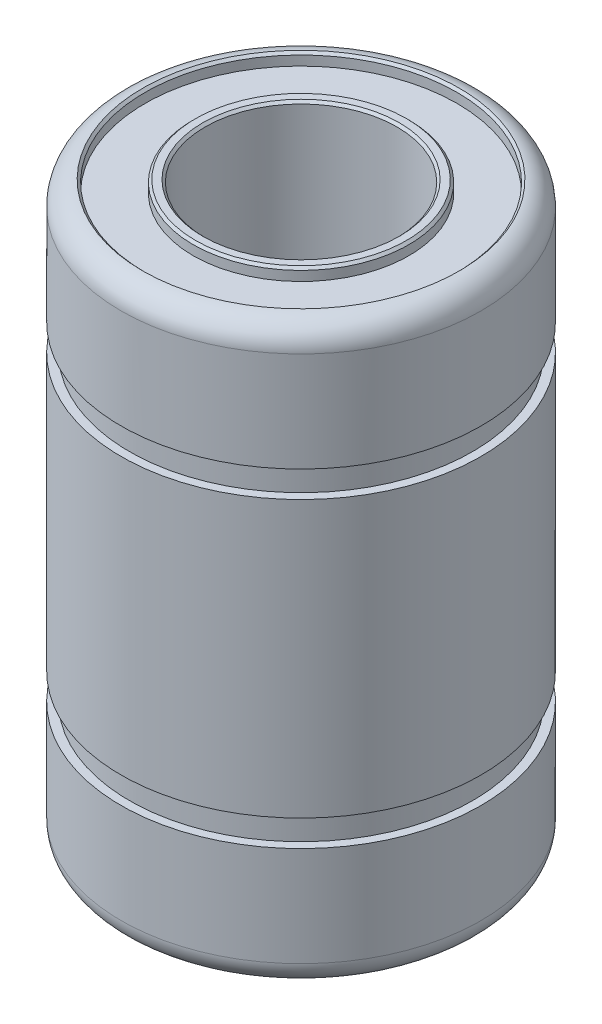
ISO-10303-21;
HEADER;
FILE_DESCRIPTION(('STEP AP214'),'2;1');
FILE_NAME('part.step','',(''),(''),'','','');
FILE_SCHEMA(('AUTOMOTIVE_DESIGN { 1 0 10303 214 1 1 1 1 }'));
ENDSEC;
DATA;
#1=APPLICATION_CONTEXT('core data for automotive mechanical design processes');
#2=APPLICATION_PROTOCOL_DEFINITION('international standard','automotive_design',2000,#1);
#3=PRODUCT_CONTEXT('',#1,'mechanical');
#4=PRODUCT('Part','Part','',(#3));
#5=PRODUCT_RELATED_PRODUCT_CATEGORY('part','',(#4));
#6=PRODUCT_DEFINITION_FORMATION('','',#4);
#7=PRODUCT_DEFINITION_CONTEXT('part definition',#1,'design');
#8=PRODUCT_DEFINITION('design','',#6,#7);
#9=PRODUCT_DEFINITION_SHAPE('','',#8);
#10=(LENGTH_UNIT() NAMED_UNIT(*) SI_UNIT(.MILLI.,.METRE.));
#11=(NAMED_UNIT(*) PLANE_ANGLE_UNIT() SI_UNIT($,.RADIAN.));
#12=(NAMED_UNIT(*) SI_UNIT($,.STERADIAN.) SOLID_ANGLE_UNIT());
#13=UNCERTAINTY_MEASURE_WITH_UNIT(LENGTH_MEASURE(1.E-05),#10,'distance_accuracy_value','');
#14=(GEOMETRIC_REPRESENTATION_CONTEXT(3) GLOBAL_UNCERTAINTY_ASSIGNED_CONTEXT((#13)) GLOBAL_UNIT_ASSIGNED_CONTEXT((#10,
#11,#12)) REPRESENTATION_CONTEXT('',''));
#15=CARTESIAN_POINT('',(0.,0.,0.));
#16=DIRECTION('',(0.,0.,1.));
#17=DIRECTION('',(1.,0.,0.));
#18=AXIS2_PLACEMENT_3D('',#15,#16,#17);
#19=CARTESIAN_POINT('',(0.,0.,0.));
#20=DIRECTION('',(0.,-1.,0.));
#21=DIRECTION('',(0.,0.,-1.));
#22=AXIS2_PLACEMENT_3D('',#19,#20,#21);
#23=CYLINDRICAL_SURFACE('',#22,4.);
#24=CARTESIAN_POINT('',(0.,0.0999999999999993,0.));
#25=DIRECTION('',(0.,-1.,0.));
#26=DIRECTION('',(0.,0.,-1.));
#27=AXIS2_PLACEMENT_3D('',#24,#25,#26);
#28=CIRCLE('',#27,4.);
#29=CARTESIAN_POINT('',(0.,0.0999999999999993,-4.));
#30=VERTEX_POINT('',#29);
#31=EDGE_CURVE('E59',#30,#30,#28,.T.);
#32=ORIENTED_EDGE('',*,*,#31,.T.);
#33=EDGE_LOOP('',(#32));
#34=FACE_BOUND('',#33,.T.);
#35=CARTESIAN_POINT('',(0.,23.9,0.));
#36=DIRECTION('',(0.,1.,0.));
#37=DIRECTION('',(0.,0.,1.));
#38=AXIS2_PLACEMENT_3D('',#35,#36,#37);
#39=CIRCLE('',#38,4.);
#40=CARTESIAN_POINT('',(0.,23.9,4.));
#41=VERTEX_POINT('',#40);
#42=EDGE_CURVE('E62',#41,#41,#39,.T.);
#43=ORIENTED_EDGE('',*,*,#42,.T.);
#44=EDGE_LOOP('',(#43));
#45=FACE_BOUND('',#44,.T.);
#46=ADVANCED_FACE('F30',(#34,#45),#23,.F.);
#47=CARTESIAN_POINT('',(4.,24.,0.));
#48=DIRECTION('',(0.,1.,0.));
#49=DIRECTION('',(0.,0.,1.));
#50=AXIS2_PLACEMENT_3D('',#47,#48,#49);
#51=PLANE('',#50);
#52=CARTESIAN_POINT('',(0.,24.,0.));
#53=DIRECTION('',(0.,1.,0.));
#54=DIRECTION('',(0.,0.,1.));
#55=AXIS2_PLACEMENT_3D('',#52,#53,#54);
#56=CIRCLE('',#55,4.39999999999999);
#57=CARTESIAN_POINT('',(0.,24.,4.39999999999999));
#58=VERTEX_POINT('',#57);
#59=EDGE_CURVE('E41',#58,#58,#56,.T.);
#60=ORIENTED_EDGE('',*,*,#59,.T.);
#61=EDGE_LOOP('',(#60));
#62=FACE_BOUND('',#61,.T.);
#63=CARTESIAN_POINT('',(0.,24.,0.));
#64=DIRECTION('',(0.,1.,0.));
#65=DIRECTION('',(0.,0.,1.));
#66=AXIS2_PLACEMENT_3D('',#63,#64,#65);
#67=CIRCLE('',#66,4.1);
#68=CARTESIAN_POINT('',(0.,24.,4.1));
#69=VERTEX_POINT('',#68);
#70=EDGE_CURVE('E45',#69,#69,#67,.F.);
#71=ORIENTED_EDGE('',*,*,#70,.T.);
#72=EDGE_LOOP('',(#71));
#73=FACE_BOUND('',#72,.T.);
#74=ADVANCED_FACE('F135',(#62,#73),#51,.T.);
#75=CARTESIAN_POINT('',(0.,0.,0.));
#76=DIRECTION('',(0.,-1.,0.));
#77=DIRECTION('',(0.,0.,-1.));
#78=AXIS2_PLACEMENT_3D('',#75,#76,#77);
#79=CYLINDRICAL_SURFACE('',#78,4.5);
#80=CARTESIAN_POINT('',(0.,23.9,0.));
#81=DIRECTION('',(0.,1.,0.));
#82=DIRECTION('',(0.,0.,1.));
#83=AXIS2_PLACEMENT_3D('',#80,#81,#82);
#84=CIRCLE('',#83,4.5);
#85=CARTESIAN_POINT('',(0.,23.9,4.5));
#86=VERTEX_POINT('',#85);
#87=EDGE_CURVE('E50',#86,#86,#84,.F.);
#88=ORIENTED_EDGE('',*,*,#87,.T.);
#89=EDGE_LOOP('',(#88));
#90=FACE_BOUND('',#89,.T.);
#91=CARTESIAN_POINT('',(0.,23.5,0.));
#92=DIRECTION('',(0.,-1.,0.));
#93=DIRECTION('',(0.,0.,-1.));
#94=AXIS2_PLACEMENT_3D('',#91,#92,#93);
#95=CIRCLE('',#94,4.5);
#96=CARTESIAN_POINT('',(0.,23.5,-4.5));
#97=VERTEX_POINT('',#96);
#98=EDGE_CURVE('E80',#97,#97,#95,.T.);
#99=ORIENTED_EDGE('',*,*,#98,.F.);
#100=EDGE_LOOP('',(#99));
#101=FACE_BOUND('',#100,.T.);
#102=ADVANCED_FACE('F141',(#90,#101),#79,.T.);
#103=CARTESIAN_POINT('',(4.5,23.5,0.));
#104=DIRECTION('',(0.,1.,0.));
#105=DIRECTION('',(0.,0.,1.));
#106=AXIS2_PLACEMENT_3D('',#103,#104,#105);
#107=PLANE('',#106);
#108=ORIENTED_EDGE('',*,*,#98,.T.);
#109=EDGE_LOOP('',(#108));
#110=FACE_BOUND('',#109,.T.);
#111=CARTESIAN_POINT('',(0.,23.5,0.));
#112=DIRECTION('',(0.,-1.,0.));
#113=DIRECTION('',(0.,0.,-1.));
#114=AXIS2_PLACEMENT_3D('',#111,#112,#113);
#115=CIRCLE('',#114,6.5);
#116=CARTESIAN_POINT('',(0.,23.5,-6.5));
#117=VERTEX_POINT('',#116);
#118=EDGE_CURVE('E83',#117,#117,#115,.T.);
#119=ORIENTED_EDGE('',*,*,#118,.F.);
#120=EDGE_LOOP('',(#119));
#121=FACE_BOUND('',#120,.T.);
#122=ADVANCED_FACE('F283',(#110,#121),#107,.T.);
#123=CARTESIAN_POINT('',(0.,0.,0.));
#124=DIRECTION('',(0.,-1.,0.));
#125=DIRECTION('',(0.,0.,-1.));
#126=AXIS2_PLACEMENT_3D('',#123,#124,#125);
#127=CYLINDRICAL_SURFACE('',#126,6.5);
#128=CARTESIAN_POINT('',(0.,23.9,0.));
#129=DIRECTION('',(0.,1.,0.));
#130=DIRECTION('',(0.,0.,1.));
#131=AXIS2_PLACEMENT_3D('',#128,#129,#130);
#132=CIRCLE('',#131,6.5);
#133=CARTESIAN_POINT('',(0.,23.9,6.5));
#134=VERTEX_POINT('',#133);
#135=EDGE_CURVE('E53',#134,#134,#132,.T.);
#136=ORIENTED_EDGE('',*,*,#135,.T.);
#137=EDGE_LOOP('',(#136));
#138=FACE_BOUND('',#137,.T.);
#139=ORIENTED_EDGE('',*,*,#118,.T.);
#140=EDGE_LOOP('',(#139));
#141=FACE_BOUND('',#140,.T.);
#142=ADVANCED_FACE('F216',(#138,#141),#127,.F.);
#143=CARTESIAN_POINT('',(0.,0.,0.));
#144=DIRECTION('',(0.,-1.,0.));
#145=DIRECTION('',(0.,0.,-1.));
#146=AXIS2_PLACEMENT_3D('',#143,#144,#145);
#147=CYLINDRICAL_SURFACE('',#146,7.5);
#148=CARTESIAN_POINT('',(0.,23.0050125628934,0.));
#149=DIRECTION('',(0.,1.,0.));
#150=DIRECTION('',(0.,0.,1.));
#151=AXIS2_PLACEMENT_3D('',#148,#149,#150);
#152=CIRCLE('',#151,7.5);
#153=CARTESIAN_POINT('',(0.,23.0050125628934,7.5));
#154=VERTEX_POINT('',#153);
#155=EDGE_CURVE('E10',#154,#154,#152,.F.);
#156=ORIENTED_EDGE('',*,*,#155,.T.);
#157=EDGE_LOOP('',(#156));
#158=FACE_BOUND('',#157,.T.);
#159=CARTESIAN_POINT('',(0.,18.85,0.));
#160=DIRECTION('',(0.,-1.,0.));
#161=DIRECTION('',(0.,0.,-1.));
#162=AXIS2_PLACEMENT_3D('',#159,#160,#161);
#163=CIRCLE('',#162,7.5);
#164=CARTESIAN_POINT('',(0.,18.85,-7.5));
#165=VERTEX_POINT('',#164);
#166=EDGE_CURVE('E86',#165,#165,#163,.T.);
#167=ORIENTED_EDGE('',*,*,#166,.F.);
#168=EDGE_LOOP('',(#167));
#169=FACE_BOUND('',#168,.T.);
#170=ADVANCED_FACE('F210',(#158,#169),#147,.T.);
#171=CARTESIAN_POINT('',(7.5,18.85,0.));
#172=DIRECTION('',(0.,-1.,0.));
#173=DIRECTION('',(0.,0.,-1.));
#174=AXIS2_PLACEMENT_3D('',#171,#172,#173);
#175=PLANE('',#174);
#176=ORIENTED_EDGE('',*,*,#166,.T.);
#177=EDGE_LOOP('',(#176));
#178=FACE_BOUND('',#177,.T.);
#179=CARTESIAN_POINT('',(0.,18.85,0.));
#180=DIRECTION('',(0.,-1.,0.));
#181=DIRECTION('',(0.,0.,-1.));
#182=AXIS2_PLACEMENT_3D('',#179,#180,#181);
#183=CIRCLE('',#182,7.15);
#184=CARTESIAN_POINT('',(0.,18.85,-7.15));
#185=VERTEX_POINT('',#184);
#186=EDGE_CURVE('E89',#185,#185,#183,.T.);
#187=ORIENTED_EDGE('',*,*,#186,.F.);
#188=EDGE_LOOP('',(#187));
#189=FACE_BOUND('',#188,.T.);
#190=ADVANCED_FACE('F215',(#178,#189),#175,.T.);
#191=CARTESIAN_POINT('',(0.,0.,0.));
#192=DIRECTION('',(0.,-1.,0.));
#193=DIRECTION('',(0.,0.,-1.));
#194=AXIS2_PLACEMENT_3D('',#191,#192,#193);
#195=CYLINDRICAL_SURFACE('',#194,7.15);
#196=ORIENTED_EDGE('',*,*,#186,.T.);
#197=EDGE_LOOP('',(#196));
#198=FACE_BOUND('',#197,.T.);
#199=CARTESIAN_POINT('',(0.,17.75,0.));
#200=DIRECTION('',(0.,-1.,0.));
#201=DIRECTION('',(0.,0.,-1.));
#202=AXIS2_PLACEMENT_3D('',#199,#200,#201);
#203=CIRCLE('',#202,7.15);
#204=CARTESIAN_POINT('',(0.,17.75,-7.15));
#205=VERTEX_POINT('',#204);
#206=EDGE_CURVE('E92',#205,#205,#203,.T.);
#207=ORIENTED_EDGE('',*,*,#206,.F.);
#208=EDGE_LOOP('',(#207));
#209=FACE_BOUND('',#208,.T.);
#210=ADVANCED_FACE('F354',(#198,#209),#195,.T.);
#211=CARTESIAN_POINT('',(7.5,17.75,0.));
#212=DIRECTION('',(0.,1.,0.));
#213=DIRECTION('',(0.,0.,1.));
#214=AXIS2_PLACEMENT_3D('',#211,#212,#213);
#215=PLANE('',#214);
#216=ORIENTED_EDGE('',*,*,#206,.T.);
#217=EDGE_LOOP('',(#216));
#218=FACE_BOUND('',#217,.T.);
#219=CARTESIAN_POINT('',(0.,17.75,0.));
#220=DIRECTION('',(0.,-1.,0.));
#221=DIRECTION('',(0.,0.,-1.));
#222=AXIS2_PLACEMENT_3D('',#219,#220,#221);
#223=CIRCLE('',#222,7.5);
#224=CARTESIAN_POINT('',(0.,17.75,-7.5));
#225=VERTEX_POINT('',#224);
#226=EDGE_CURVE('E95',#225,#225,#223,.T.);
#227=ORIENTED_EDGE('',*,*,#226,.F.);
#228=EDGE_LOOP('',(#227));
#229=FACE_BOUND('',#228,.T.);
#230=ADVANCED_FACE('F344',(#218,#229),#215,.T.);
#231=CARTESIAN_POINT('',(0.,0.,0.));
#232=DIRECTION('',(0.,-1.,0.));
#233=DIRECTION('',(0.,0.,-1.));
#234=AXIS2_PLACEMENT_3D('',#231,#232,#233);
#235=CYLINDRICAL_SURFACE('',#234,7.5);
#236=ORIENTED_EDGE('',*,*,#226,.T.);
#237=EDGE_LOOP('',(#236));
#238=FACE_BOUND('',#237,.T.);
#239=CARTESIAN_POINT('',(0.,6.25,0.));
#240=DIRECTION('',(0.,-1.,0.));
#241=DIRECTION('',(0.,0.,-1.));
#242=AXIS2_PLACEMENT_3D('',#239,#240,#241);
#243=CIRCLE('',#242,7.5);
#244=CARTESIAN_POINT('',(0.,6.25,-7.5));
#245=VERTEX_POINT('',#244);
#246=EDGE_CURVE('E98',#245,#245,#243,.T.);
#247=ORIENTED_EDGE('',*,*,#246,.F.);
#248=EDGE_LOOP('',(#247));
#249=FACE_BOUND('',#248,.T.);
#250=ADVANCED_FACE('F334',(#238,#249),#235,.T.);
#251=CARTESIAN_POINT('',(7.5,6.25,0.));
#252=DIRECTION('',(0.,-1.,0.));
#253=DIRECTION('',(0.,0.,-1.));
#254=AXIS2_PLACEMENT_3D('',#251,#252,#253);
#255=PLANE('',#254);
#256=ORIENTED_EDGE('',*,*,#246,.T.);
#257=EDGE_LOOP('',(#256));
#258=FACE_BOUND('',#257,.T.);
#259=CARTESIAN_POINT('',(0.,6.25,0.));
#260=DIRECTION('',(0.,-1.,0.));
#261=DIRECTION('',(0.,0.,-1.));
#262=AXIS2_PLACEMENT_3D('',#259,#260,#261);
#263=CIRCLE('',#262,7.15);
#264=CARTESIAN_POINT('',(0.,6.25,-7.15));
#265=VERTEX_POINT('',#264);
#266=EDGE_CURVE('E101',#265,#265,#263,.T.);
#267=ORIENTED_EDGE('',*,*,#266,.F.);
#268=EDGE_LOOP('',(#267));
#269=FACE_BOUND('',#268,.T.);
#270=ADVANCED_FACE('F324',(#258,#269),#255,.T.);
#271=CARTESIAN_POINT('',(0.,0.,0.));
#272=DIRECTION('',(0.,-1.,0.));
#273=DIRECTION('',(0.,0.,-1.));
#274=AXIS2_PLACEMENT_3D('',#271,#272,#273);
#275=CYLINDRICAL_SURFACE('',#274,7.15);
#276=ORIENTED_EDGE('',*,*,#266,.T.);
#277=EDGE_LOOP('',(#276));
#278=FACE_BOUND('',#277,.T.);
#279=CARTESIAN_POINT('',(0.,5.15,0.));
#280=DIRECTION('',(0.,-1.,0.));
#281=DIRECTION('',(0.,0.,-1.));
#282=AXIS2_PLACEMENT_3D('',#279,#280,#281);
#283=CIRCLE('',#282,7.15);
#284=CARTESIAN_POINT('',(0.,5.15,-7.15));
#285=VERTEX_POINT('',#284);
#286=EDGE_CURVE('E104',#285,#285,#283,.T.);
#287=ORIENTED_EDGE('',*,*,#286,.F.);
#288=EDGE_LOOP('',(#287));
#289=FACE_BOUND('',#288,.T.);
#290=ADVANCED_FACE('F314',(#278,#289),#275,.T.);
#291=CARTESIAN_POINT('',(7.5,5.15,0.));
#292=DIRECTION('',(0.,1.,0.));
#293=DIRECTION('',(0.,0.,1.));
#294=AXIS2_PLACEMENT_3D('',#291,#292,#293);
#295=PLANE('',#294);
#296=ORIENTED_EDGE('',*,*,#286,.T.);
#297=EDGE_LOOP('',(#296));
#298=FACE_BOUND('',#297,.T.);
#299=CARTESIAN_POINT('',(0.,5.15,0.));
#300=DIRECTION('',(0.,-1.,0.));
#301=DIRECTION('',(0.,0.,-1.));
#302=AXIS2_PLACEMENT_3D('',#299,#300,#301);
#303=CIRCLE('',#302,7.5);
#304=CARTESIAN_POINT('',(0.,5.15,-7.5));
#305=VERTEX_POINT('',#304);
#306=EDGE_CURVE('E107',#305,#305,#303,.T.);
#307=ORIENTED_EDGE('',*,*,#306,.F.);
#308=EDGE_LOOP('',(#307));
#309=FACE_BOUND('',#308,.T.);
#310=ADVANCED_FACE('F202',(#298,#309),#295,.T.);
#311=CARTESIAN_POINT('',(0.,0.,0.));
#312=DIRECTION('',(0.,-1.,0.));
#313=DIRECTION('',(0.,0.,-1.));
#314=AXIS2_PLACEMENT_3D('',#311,#312,#313);
#315=CYLINDRICAL_SURFACE('',#314,7.5);
#316=CARTESIAN_POINT('',(0.,0.994987437106619,0.));
#317=DIRECTION('',(0.,-1.,0.));
#318=DIRECTION('',(0.,0.,-1.));
#319=AXIS2_PLACEMENT_3D('',#316,#317,#318);
#320=CIRCLE('',#319,7.5);
#321=CARTESIAN_POINT('',(0.,0.994987437106619,-7.5));
#322=VERTEX_POINT('',#321);
#323=EDGE_CURVE('E37',#322,#322,#320,.F.);
#324=ORIENTED_EDGE('',*,*,#323,.T.);
#325=EDGE_LOOP('',(#324));
#326=FACE_BOUND('',#325,.T.);
#327=ORIENTED_EDGE('',*,*,#306,.T.);
#328=EDGE_LOOP('',(#327));
#329=FACE_BOUND('',#328,.T.);
#330=ADVANCED_FACE('F131',(#326,#329),#315,.T.);
#331=CARTESIAN_POINT('',(0.,0.,0.));
#332=DIRECTION('',(0.,-1.,0.));
#333=DIRECTION('',(0.,0.,-1.));
#334=AXIS2_PLACEMENT_3D('',#331,#332,#333);
#335=CYLINDRICAL_SURFACE('',#334,6.5);
#336=CARTESIAN_POINT('',(0.,0.100000000000002,0.));
#337=DIRECTION('',(0.,-1.,0.));
#338=DIRECTION('',(0.,0.,-1.));
#339=AXIS2_PLACEMENT_3D('',#336,#337,#338);
#340=CIRCLE('',#339,6.5);
#341=CARTESIAN_POINT('',(0.,0.100000000000002,-6.5));
#342=VERTEX_POINT('',#341);
#343=EDGE_CURVE('E77',#342,#342,#340,.T.);
#344=ORIENTED_EDGE('',*,*,#343,.T.);
#345=EDGE_LOOP('',(#344));
#346=FACE_BOUND('',#345,.T.);
#347=CARTESIAN_POINT('',(0.,0.5,0.));
#348=DIRECTION('',(0.,-1.,0.));
#349=DIRECTION('',(0.,0.,-1.));
#350=AXIS2_PLACEMENT_3D('',#347,#348,#349);
#351=CIRCLE('',#350,6.5);
#352=CARTESIAN_POINT('',(0.,0.5,-6.5));
#353=VERTEX_POINT('',#352);
#354=EDGE_CURVE('E110',#353,#353,#351,.T.);
#355=ORIENTED_EDGE('',*,*,#354,.F.);
#356=EDGE_LOOP('',(#355));
#357=FACE_BOUND('',#356,.T.);
#358=ADVANCED_FACE('F121',(#346,#357),#335,.F.);
#359=CARTESIAN_POINT('',(6.5,0.5,0.));
#360=DIRECTION('',(0.,-1.,0.));
#361=DIRECTION('',(0.,0.,-1.));
#362=AXIS2_PLACEMENT_3D('',#359,#360,#361);
#363=PLANE('',#362);
#364=ORIENTED_EDGE('',*,*,#354,.T.);
#365=EDGE_LOOP('',(#364));
#366=FACE_BOUND('',#365,.T.);
#367=CARTESIAN_POINT('',(0.,0.5,0.));
#368=DIRECTION('',(0.,-1.,0.));
#369=DIRECTION('',(0.,0.,-1.));
#370=AXIS2_PLACEMENT_3D('',#367,#368,#369);
#371=CIRCLE('',#370,4.5);
#372=CARTESIAN_POINT('',(0.,0.5,-4.5));
#373=VERTEX_POINT('',#372);
#374=EDGE_CURVE('E113',#373,#373,#371,.T.);
#375=ORIENTED_EDGE('',*,*,#374,.F.);
#376=EDGE_LOOP('',(#375));
#377=FACE_BOUND('',#376,.T.);
#378=ADVANCED_FACE('F119',(#366,#377),#363,.T.);
#379=CARTESIAN_POINT('',(0.,0.,0.));
#380=DIRECTION('',(0.,-1.,0.));
#381=DIRECTION('',(0.,0.,-1.));
#382=AXIS2_PLACEMENT_3D('',#379,#380,#381);
#383=CYLINDRICAL_SURFACE('',#382,4.5);
#384=CARTESIAN_POINT('',(0.,0.0999999999999932,0.));
#385=DIRECTION('',(0.,-1.,0.));
#386=DIRECTION('',(0.,0.,-1.));
#387=AXIS2_PLACEMENT_3D('',#384,#385,#386);
#388=CIRCLE('',#387,4.5);
#389=CARTESIAN_POINT('',(0.,0.0999999999999932,-4.5));
#390=VERTEX_POINT('',#389);
#391=EDGE_CURVE('E65',#390,#390,#388,.F.);
#392=ORIENTED_EDGE('',*,*,#391,.T.);
#393=EDGE_LOOP('',(#392));
#394=FACE_BOUND('',#393,.T.);
#395=ORIENTED_EDGE('',*,*,#374,.T.);
#396=EDGE_LOOP('',(#395));
#397=FACE_BOUND('',#396,.T.);
#398=ADVANCED_FACE('F117',(#394,#397),#383,.T.);
#399=CARTESIAN_POINT('',(4.,0.,0.));
#400=DIRECTION('',(0.,-1.,0.));
#401=DIRECTION('',(0.,0.,-1.));
#402=AXIS2_PLACEMENT_3D('',#399,#400,#401);
#403=PLANE('',#402);
#404=CARTESIAN_POINT('',(0.,0.,0.));
#405=DIRECTION('',(0.,-1.,0.));
#406=DIRECTION('',(0.,0.,-1.));
#407=AXIS2_PLACEMENT_3D('',#404,#405,#406);
#408=CIRCLE('',#407,4.40000000000001);
#409=CARTESIAN_POINT('',(0.,0.,-4.40000000000001));
#410=VERTEX_POINT('',#409);
#411=EDGE_CURVE('E68',#410,#410,#408,.T.);
#412=ORIENTED_EDGE('',*,*,#411,.T.);
#413=EDGE_LOOP('',(#412));
#414=FACE_BOUND('',#413,.T.);
#415=CARTESIAN_POINT('',(0.,0.,0.));
#416=DIRECTION('',(0.,-1.,0.));
#417=DIRECTION('',(0.,0.,-1.));
#418=AXIS2_PLACEMENT_3D('',#415,#416,#417);
#419=CIRCLE('',#418,4.1);
#420=CARTESIAN_POINT('',(0.,0.,-4.1));
#421=VERTEX_POINT('',#420);
#422=EDGE_CURVE('E71',#421,#421,#419,.F.);
#423=ORIENTED_EDGE('',*,*,#422,.T.);
#424=EDGE_LOOP('',(#423));
#425=FACE_BOUND('',#424,.T.);
#426=ADVANCED_FACE('F128',(#414,#425),#403,.T.);
#427=CARTESIAN_POINT('',(0.,0.100000000000002,0.));
#428=DIRECTION('',(0.,-1.,0.));
#429=DIRECTION('',(0.,0.,-1.));
#430=AXIS2_PLACEMENT_3D('',#427,#428,#429);
#431=CONICAL_SURFACE('',#430,6.5,0.78539816339747);
#432=CARTESIAN_POINT('',(0.,0.,0.));
#433=DIRECTION('',(0.,-1.,0.));
#434=DIRECTION('',(0.,0.,-1.));
#435=AXIS2_PLACEMENT_3D('',#432,#433,#434);
#436=CIRCLE('',#435,6.60000000000001);
#437=CARTESIAN_POINT('',(0.,0.,-6.60000000000001));
#438=VERTEX_POINT('',#437);
#439=EDGE_CURVE('E74',#438,#438,#436,.F.);
#440=ORIENTED_EDGE('',*,*,#439,.F.);
#441=EDGE_LOOP('',(#440));
#442=FACE_BOUND('',#441,.T.);
#443=ORIENTED_EDGE('',*,*,#343,.F.);
#444=EDGE_LOOP('',(#443));
#445=FACE_BOUND('',#444,.T.);
#446=ADVANCED_FACE('F147',(#442,#445),#431,.F.);
#447=CARTESIAN_POINT('',(0.,0.,0.));
#448=DIRECTION('',(0.,1.,0.));
#449=DIRECTION('',(0.,0.,1.));
#450=AXIS2_PLACEMENT_3D('',#447,#448,#449);
#451=CONICAL_SURFACE('',#450,4.40000000000001,0.785398163397457);
#452=ORIENTED_EDGE('',*,*,#391,.F.);
#453=EDGE_LOOP('',(#452));
#454=FACE_BOUND('',#453,.T.);
#455=ORIENTED_EDGE('',*,*,#411,.F.);
#456=EDGE_LOOP('',(#455));
#457=FACE_BOUND('',#456,.T.);
#458=ADVANCED_FACE('F150',(#454,#457),#451,.T.);
#459=CARTESIAN_POINT('',(0.,0.0999999999999993,0.));
#460=DIRECTION('',(0.,-1.,0.));
#461=DIRECTION('',(0.,0.,-1.));
#462=AXIS2_PLACEMENT_3D('',#459,#460,#461);
#463=CONICAL_SURFACE('',#462,4.,0.785398163397466);
#464=ORIENTED_EDGE('',*,*,#422,.F.);
#465=EDGE_LOOP('',(#464));
#466=FACE_BOUND('',#465,.T.);
#467=ORIENTED_EDGE('',*,*,#31,.F.);
#468=EDGE_LOOP('',(#467));
#469=FACE_BOUND('',#468,.T.);
#470=ADVANCED_FACE('F154',(#466,#469),#463,.F.);
#471=CARTESIAN_POINT('',(0.,24.,0.));
#472=DIRECTION('',(0.,1.,0.));
#473=DIRECTION('',(0.,0.,1.));
#474=AXIS2_PLACEMENT_3D('',#471,#472,#473);
#475=CONICAL_SURFACE('',#474,6.59999999999999,0.785398163397431);
#476=ORIENTED_EDGE('',*,*,#135,.F.);
#477=EDGE_LOOP('',(#476));
#478=FACE_BOUND('',#477,.T.);
#479=CARTESIAN_POINT('',(0.,24.,0.));
#480=DIRECTION('',(0.,1.,0.));
#481=DIRECTION('',(0.,0.,1.));
#482=AXIS2_PLACEMENT_3D('',#479,#480,#481);
#483=CIRCLE('',#482,6.59999999999999);
#484=CARTESIAN_POINT('',(0.,24.,6.59999999999999));
#485=VERTEX_POINT('',#484);
#486=EDGE_CURVE('E56',#485,#485,#483,.F.);
#487=ORIENTED_EDGE('',*,*,#486,.F.);
#488=EDGE_LOOP('',(#487));
#489=FACE_BOUND('',#488,.T.);
#490=ADVANCED_FACE('F158',(#478,#489),#475,.F.);
#491=CARTESIAN_POINT('',(0.,23.9,0.));
#492=DIRECTION('',(0.,-1.,0.));
#493=DIRECTION('',(0.,0.,-1.));
#494=AXIS2_PLACEMENT_3D('',#491,#492,#493);
#495=CONICAL_SURFACE('',#494,4.5,0.785398163397466);
#496=ORIENTED_EDGE('',*,*,#59,.F.);
#497=EDGE_LOOP('',(#496));
#498=FACE_BOUND('',#497,.T.);
#499=ORIENTED_EDGE('',*,*,#87,.F.);
#500=EDGE_LOOP('',(#499));
#501=FACE_BOUND('',#500,.T.);
#502=ADVANCED_FACE('F162',(#498,#501),#495,.T.);
#503=CARTESIAN_POINT('',(0.,24.,0.));
#504=DIRECTION('',(0.,1.,0.));
#505=DIRECTION('',(0.,0.,1.));
#506=AXIS2_PLACEMENT_3D('',#503,#504,#505);
#507=CONICAL_SURFACE('',#506,4.1,0.785398163397466);
#508=ORIENTED_EDGE('',*,*,#42,.F.);
#509=EDGE_LOOP('',(#508));
#510=FACE_BOUND('',#509,.T.);
#511=ORIENTED_EDGE('',*,*,#70,.F.);
#512=EDGE_LOOP('',(#511));
#513=FACE_BOUND('',#512,.T.);
#514=ADVANCED_FACE('F166',(#510,#513),#507,.F.);
#515=CARTESIAN_POINT('',(0.,0.994987437106619,0.));
#516=DIRECTION('',(0.,-1.,0.));
#517=DIRECTION('',(0.,0.,-1.));
#518=AXIS2_PLACEMENT_3D('',#515,#516,#517);
#519=TOROIDAL_SURFACE('',#518,6.5,1.);
#520=ORIENTED_EDGE('',*,*,#323,.F.);
#521=EDGE_LOOP('',(#520));
#522=FACE_BOUND('',#521,.T.);
#523=ORIENTED_EDGE('',*,*,#439,.T.);
#524=EDGE_LOOP('',(#523));
#525=FACE_BOUND('',#524,.T.);
#526=ADVANCED_FACE('F169',(#522,#525),#519,.T.);
#527=CARTESIAN_POINT('',(0.,23.0050125628934,0.));
#528=DIRECTION('',(0.,1.,0.));
#529=DIRECTION('',(0.,0.,1.));
#530=AXIS2_PLACEMENT_3D('',#527,#528,#529);
#531=TOROIDAL_SURFACE('',#530,6.5,1.);
#532=ORIENTED_EDGE('',*,*,#486,.T.);
#533=EDGE_LOOP('',(#532));
#534=FACE_BOUND('',#533,.T.);
#535=ORIENTED_EDGE('',*,*,#155,.F.);
#536=EDGE_LOOP('',(#535));
#537=FACE_BOUND('',#536,.T.);
#538=ADVANCED_FACE('F32',(#534,#537),#531,.T.);
#539=CLOSED_SHELL('',(#46,#74,#102,#122,#142,#170,#190,#210,#230,#250,#270,#290,#310,#330,#358,
#378,#398,#426,#446,#458,#470,#490,#502,#514,#526,#538));
#540=MANIFOLD_SOLID_BREP('B2',#539);
#541=ADVANCED_BREP_SHAPE_REPRESENTATION('',(#18,#540),#14);
#542=SHAPE_DEFINITION_REPRESENTATION(#9,#541);
ENDSEC;
END-ISO-10303-21;
